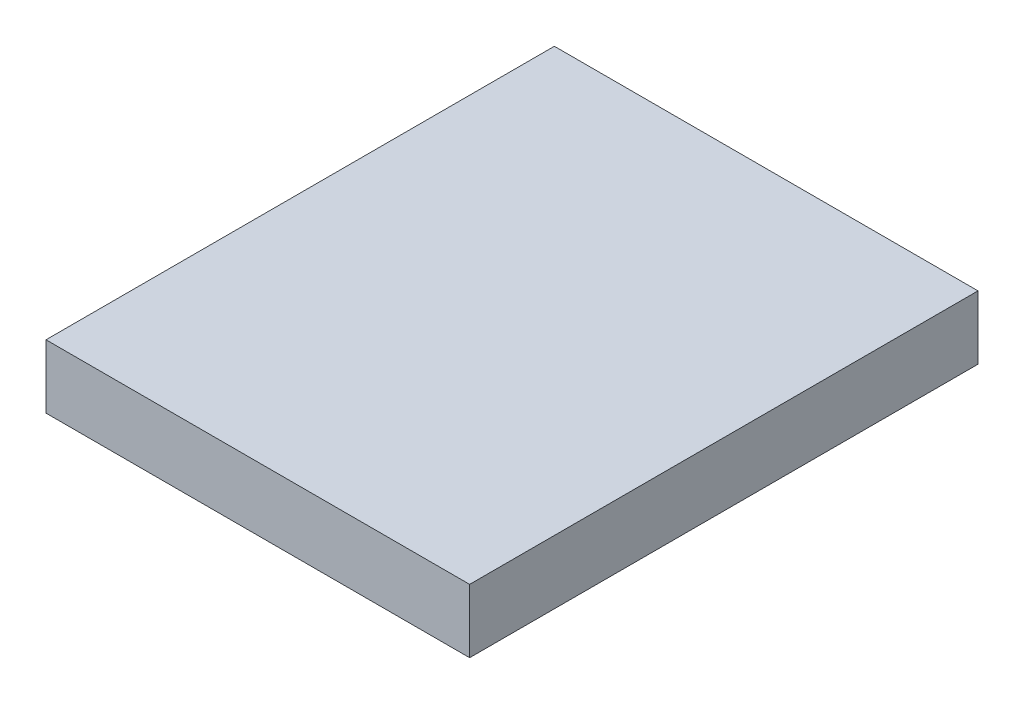
ISO-10303-21;
HEADER;
FILE_DESCRIPTION(('STEP AP214'),'2;1');
FILE_NAME('part.step','',(''),(''),'','','');
FILE_SCHEMA(('AUTOMOTIVE_DESIGN { 1 0 10303 214 1 1 1 1 }'));
ENDSEC;
DATA;
#1=APPLICATION_CONTEXT('core data for automotive mechanical design processes');
#2=APPLICATION_PROTOCOL_DEFINITION('international standard','automotive_design',2000,#1);
#3=PRODUCT_CONTEXT('',#1,'mechanical');
#4=PRODUCT('Part','Part','',(#3));
#5=PRODUCT_RELATED_PRODUCT_CATEGORY('part','',(#4));
#6=PRODUCT_DEFINITION_FORMATION('','',#4);
#7=PRODUCT_DEFINITION_CONTEXT('part definition',#1,'design');
#8=PRODUCT_DEFINITION('design','',#6,#7);
#9=PRODUCT_DEFINITION_SHAPE('','',#8);
#10=(LENGTH_UNIT() NAMED_UNIT(*) SI_UNIT(.MILLI.,.METRE.));
#11=(NAMED_UNIT(*) PLANE_ANGLE_UNIT() SI_UNIT($,.RADIAN.));
#12=(NAMED_UNIT(*) SI_UNIT($,.STERADIAN.) SOLID_ANGLE_UNIT());
#13=UNCERTAINTY_MEASURE_WITH_UNIT(LENGTH_MEASURE(1.E-05),#10,'distance_accuracy_value','');
#14=(GEOMETRIC_REPRESENTATION_CONTEXT(3) GLOBAL_UNCERTAINTY_ASSIGNED_CONTEXT((#13)) GLOBAL_UNIT_ASSIGNED_CONTEXT((#10,
#11,#12)) REPRESENTATION_CONTEXT('',''));
#15=CARTESIAN_POINT('',(0.,0.,0.));
#16=DIRECTION('',(0.,0.,1.));
#17=DIRECTION('',(1.,0.,0.));
#18=AXIS2_PLACEMENT_3D('',#15,#16,#17);
#19=CARTESIAN_POINT('',(2.5,0.75,3.));
#20=DIRECTION('',(-1.,0.,0.));
#21=DIRECTION('',(0.,0.,1.));
#22=AXIS2_PLACEMENT_3D('',#19,#20,#21);
#23=PLANE('',#22);
#24=DIRECTION('',(0.,0.,-1.));
#25=VECTOR('',#24,1.);
#26=CARTESIAN_POINT('',(2.5,0.,3.));
#27=LINE('',#26,#25);
#28=CARTESIAN_POINT('',(2.5,0.,3.));
#29=VERTEX_POINT('',#28);
#30=CARTESIAN_POINT('',(2.5,0.,-3.));
#31=VERTEX_POINT('',#30);
#32=EDGE_CURVE('E100',#29,#31,#27,.T.);
#33=ORIENTED_EDGE('',*,*,#32,.T.);
#34=DIRECTION('',(0.,-1.,0.));
#35=VECTOR('',#34,1.);
#36=CARTESIAN_POINT('',(2.5,0.75,-3.));
#37=LINE('',#36,#35);
#38=CARTESIAN_POINT('',(2.5,0.75,-3.));
#39=VERTEX_POINT('',#38);
#40=EDGE_CURVE('E11',#39,#31,#37,.T.);
#41=ORIENTED_EDGE('',*,*,#40,.F.);
#42=DIRECTION('',(0.,0.,-1.));
#43=VECTOR('',#42,1.);
#44=CARTESIAN_POINT('',(2.5,0.75,3.));
#45=LINE('',#44,#43);
#46=CARTESIAN_POINT('',(2.5,0.75,3.));
#47=VERTEX_POINT('',#46);
#48=EDGE_CURVE('E88',#47,#39,#45,.T.);
#49=ORIENTED_EDGE('',*,*,#48,.F.);
#50=DIRECTION('',(0.,-1.,0.));
#51=VECTOR('',#50,1.);
#52=CARTESIAN_POINT('',(2.5,0.75,3.));
#53=LINE('',#52,#51);
#54=EDGE_CURVE('E96',#47,#29,#53,.T.);
#55=ORIENTED_EDGE('',*,*,#54,.T.);
#56=EDGE_LOOP('',(#33,#41,#49,#55));
#57=FACE_BOUND('',#56,.T.);
#58=ADVANCED_FACE('F37',(#57),#23,.F.);
#59=CARTESIAN_POINT('',(-2.5,0.75,-3.));
#60=DIRECTION('',(0.,0.,1.));
#61=DIRECTION('',(1.,0.,0.));
#62=AXIS2_PLACEMENT_3D('',#59,#60,#61);
#63=PLANE('',#62);
#64=DIRECTION('',(-1.,0.,0.));
#65=VECTOR('',#64,1.);
#66=CARTESIAN_POINT('',(-2.5,0.,-3.));
#67=LINE('',#66,#65);
#68=CARTESIAN_POINT('',(-2.5,0.,-3.));
#69=VERTEX_POINT('',#68);
#70=EDGE_CURVE('E92',#31,#69,#67,.T.);
#71=ORIENTED_EDGE('',*,*,#70,.T.);
#72=DIRECTION('',(0.,-1.,0.));
#73=VECTOR('',#72,1.);
#74=CARTESIAN_POINT('',(-2.5,0.75,-3.));
#75=LINE('',#74,#73);
#76=CARTESIAN_POINT('',(-2.5,0.75,-3.));
#77=VERTEX_POINT('',#76);
#78=EDGE_CURVE('E45',#77,#69,#75,.T.);
#79=ORIENTED_EDGE('',*,*,#78,.F.);
#80=DIRECTION('',(-1.,0.,0.));
#81=VECTOR('',#80,1.);
#82=CARTESIAN_POINT('',(-2.5,0.75,-3.));
#83=LINE('',#82,#81);
#84=EDGE_CURVE('E83',#39,#77,#83,.T.);
#85=ORIENTED_EDGE('',*,*,#84,.F.);
#86=ORIENTED_EDGE('',*,*,#40,.T.);
#87=EDGE_LOOP('',(#71,#79,#85,#86));
#88=FACE_BOUND('',#87,.T.);
#89=ADVANCED_FACE('F91',(#88),#63,.F.);
#90=CARTESIAN_POINT('',(-2.5,0.75,3.));
#91=DIRECTION('',(1.,0.,0.));
#92=DIRECTION('',(0.,0.,-1.));
#93=AXIS2_PLACEMENT_3D('',#90,#91,#92);
#94=PLANE('',#93);
#95=DIRECTION('',(0.,0.,1.));
#96=VECTOR('',#95,1.);
#97=CARTESIAN_POINT('',(-2.5,0.,3.));
#98=LINE('',#97,#96);
#99=CARTESIAN_POINT('',(-2.5,0.,3.));
#100=VERTEX_POINT('',#99);
#101=EDGE_CURVE('E70',#69,#100,#98,.T.);
#102=ORIENTED_EDGE('',*,*,#101,.T.);
#103=DIRECTION('',(0.,-1.,0.));
#104=VECTOR('',#103,1.);
#105=CARTESIAN_POINT('',(-2.5,0.75,3.));
#106=LINE('',#105,#104);
#107=CARTESIAN_POINT('',(-2.5,0.75,3.));
#108=VERTEX_POINT('',#107);
#109=EDGE_CURVE('E93',#108,#100,#106,.T.);
#110=ORIENTED_EDGE('',*,*,#109,.F.);
#111=DIRECTION('',(0.,0.,1.));
#112=VECTOR('',#111,1.);
#113=CARTESIAN_POINT('',(-2.5,0.75,3.));
#114=LINE('',#113,#112);
#115=EDGE_CURVE('E86',#77,#108,#114,.T.);
#116=ORIENTED_EDGE('',*,*,#115,.F.);
#117=ORIENTED_EDGE('',*,*,#78,.T.);
#118=EDGE_LOOP('',(#102,#110,#116,#117));
#119=FACE_BOUND('',#118,.T.);
#120=ADVANCED_FACE('F94',(#119),#94,.F.);
#121=CARTESIAN_POINT('',(-2.5,0.75,3.));
#122=DIRECTION('',(0.,0.,-1.));
#123=DIRECTION('',(-1.,0.,0.));
#124=AXIS2_PLACEMENT_3D('',#121,#122,#123);
#125=PLANE('',#124);
#126=DIRECTION('',(1.,0.,0.));
#127=VECTOR('',#126,1.);
#128=CARTESIAN_POINT('',(-2.5,0.,3.));
#129=LINE('',#128,#127);
#130=EDGE_CURVE('E76',#100,#29,#129,.T.);
#131=ORIENTED_EDGE('',*,*,#130,.T.);
#132=ORIENTED_EDGE('',*,*,#54,.F.);
#133=DIRECTION('',(1.,0.,0.));
#134=VECTOR('',#133,1.);
#135=CARTESIAN_POINT('',(-2.5,0.75,3.));
#136=LINE('',#135,#134);
#137=EDGE_CURVE('E53',#108,#47,#136,.T.);
#138=ORIENTED_EDGE('',*,*,#137,.F.);
#139=ORIENTED_EDGE('',*,*,#109,.T.);
#140=EDGE_LOOP('',(#131,#132,#138,#139));
#141=FACE_BOUND('',#140,.T.);
#142=ADVANCED_FACE('F107',(#141),#125,.F.);
#143=CARTESIAN_POINT('',(0.,0.75,0.));
#144=DIRECTION('',(0.,-1.,0.));
#145=DIRECTION('',(0.,0.,-1.));
#146=AXIS2_PLACEMENT_3D('',#143,#144,#145);
#147=PLANE('',#146);
#148=ORIENTED_EDGE('',*,*,#48,.T.);
#149=ORIENTED_EDGE('',*,*,#84,.T.);
#150=ORIENTED_EDGE('',*,*,#115,.T.);
#151=ORIENTED_EDGE('',*,*,#137,.T.);
#152=EDGE_LOOP('',(#148,#149,#150,#151));
#153=FACE_BOUND('',#152,.T.);
#154=ADVANCED_FACE('F84',(#153),#147,.F.);
#155=CARTESIAN_POINT('',(0.,0.,0.));
#156=DIRECTION('',(0.,-1.,0.));
#157=DIRECTION('',(0.,0.,-1.));
#158=AXIS2_PLACEMENT_3D('',#155,#156,#157);
#159=PLANE('',#158);
#160=ORIENTED_EDGE('',*,*,#32,.F.);
#161=ORIENTED_EDGE('',*,*,#130,.F.);
#162=ORIENTED_EDGE('',*,*,#101,.F.);
#163=ORIENTED_EDGE('',*,*,#70,.F.);
#164=EDGE_LOOP('',(#160,#161,#162,#163));
#165=FACE_BOUND('',#164,.T.);
#166=ADVANCED_FACE('F110',(#165),#159,.T.);
#167=CLOSED_SHELL('',(#58,#89,#120,#142,#154,#166));
#168=MANIFOLD_SOLID_BREP('B2',#167);
#169=ADVANCED_BREP_SHAPE_REPRESENTATION('',(#18,#168),#14);
#170=SHAPE_DEFINITION_REPRESENTATION(#9,#169);
ENDSEC;
END-ISO-10303-21;
